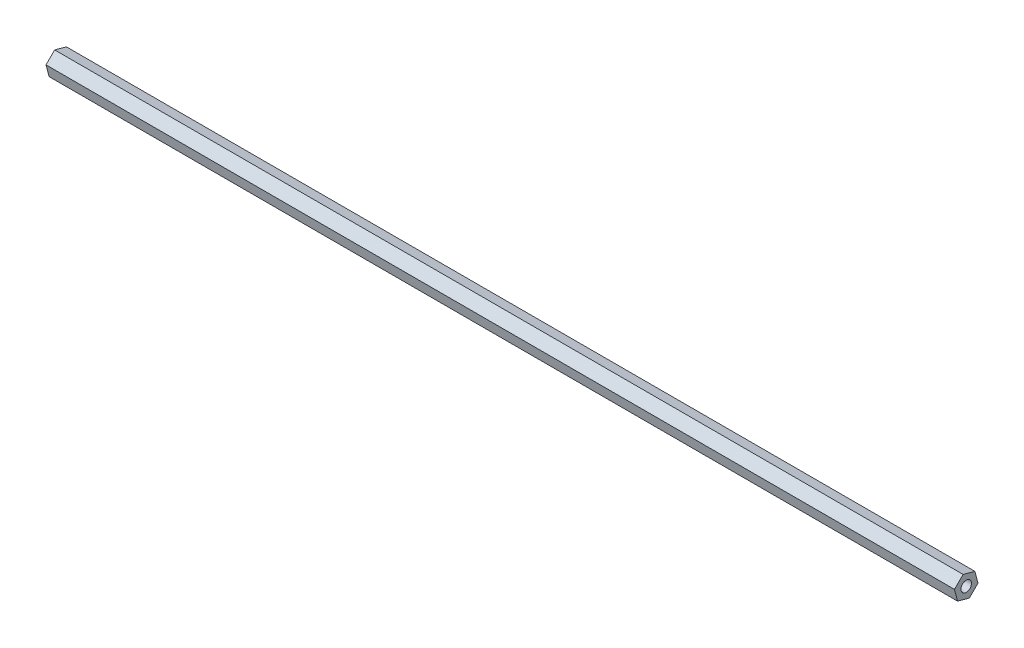
ISO-10303-21;
HEADER;
FILE_DESCRIPTION(('STEP AP214'),'2;1');
FILE_NAME('part.step','',(''),(''),'','','');
FILE_SCHEMA(('AUTOMOTIVE_DESIGN { 1 0 10303 214 1 1 1 1 }'));
ENDSEC;
DATA;
#1=APPLICATION_CONTEXT('core data for automotive mechanical design processes');
#2=APPLICATION_PROTOCOL_DEFINITION('international standard','automotive_design',2000,#1);
#3=PRODUCT_CONTEXT('',#1,'mechanical');
#4=PRODUCT('Part','Part','',(#3));
#5=PRODUCT_RELATED_PRODUCT_CATEGORY('part','',(#4));
#6=PRODUCT_DEFINITION_FORMATION('','',#4);
#7=PRODUCT_DEFINITION_CONTEXT('part definition',#1,'design');
#8=PRODUCT_DEFINITION('design','',#6,#7);
#9=PRODUCT_DEFINITION_SHAPE('','',#8);
#10=(LENGTH_UNIT() NAMED_UNIT(*) SI_UNIT(.MILLI.,.METRE.));
#11=(NAMED_UNIT(*) PLANE_ANGLE_UNIT() SI_UNIT($,.RADIAN.));
#12=(NAMED_UNIT(*) SI_UNIT($,.STERADIAN.) SOLID_ANGLE_UNIT());
#13=UNCERTAINTY_MEASURE_WITH_UNIT(LENGTH_MEASURE(1.E-05),#10,'distance_accuracy_value','');
#14=(GEOMETRIC_REPRESENTATION_CONTEXT(3) GLOBAL_UNCERTAINTY_ASSIGNED_CONTEXT((#13)) GLOBAL_UNIT_ASSIGNED_CONTEXT((#10,
#11,#12)) REPRESENTATION_CONTEXT('',''));
#15=CARTESIAN_POINT('',(0.,0.,0.));
#16=DIRECTION('',(0.,0.,1.));
#17=DIRECTION('',(1.,0.,0.));
#18=AXIS2_PLACEMENT_3D('',#15,#16,#17);
#19=CARTESIAN_POINT('',(546.1,-1.92681784977775,-7.07465238065527));
#20=DIRECTION('',(0.,-0.254850544088576,0.9669804549099));
#21=DIRECTION('',(0.,-0.9669804549099,-0.254850544088576));
#22=AXIS2_PLACEMENT_3D('',#19,#20,#21);
#23=PLANE('',#22);
#24=DIRECTION('',(0.,0.9669804549099,0.254850544088576));
#25=VECTOR('',#24,1.);
#26=CARTESIAN_POINT('',(0.,-1.92681784977775,-7.07465238065527));
#27=LINE('',#26,#25);
#28=CARTESIAN_POINT('',(0.,-1.92681784977775,-7.07465238065527));
#29=VERTEX_POINT('',#28);
#30=CARTESIAN_POINT('',(0.,5.16341975970264,-5.20599939670046));
#31=VERTEX_POINT('',#30);
#32=EDGE_CURVE('E120',#29,#31,#27,.T.);
#33=ORIENTED_EDGE('',*,*,#32,.T.);
#34=DIRECTION('',(-1.,0.,0.));
#35=VECTOR('',#34,1.);
#36=CARTESIAN_POINT('',(546.1,5.16341975970264,-5.20599939670046));
#37=LINE('',#36,#35);
#38=CARTESIAN_POINT('',(546.1,5.16341975970264,-5.20599939670046));
#39=VERTEX_POINT('',#38);
#40=EDGE_CURVE('E11',#39,#31,#37,.T.);
#41=ORIENTED_EDGE('',*,*,#40,.F.);
#42=DIRECTION('',(0.,0.9669804549099,0.254850544088576));
#43=VECTOR('',#42,1.);
#44=CARTESIAN_POINT('',(546.1,-1.92681784977775,-7.07465238065527));
#45=LINE('',#44,#43);
#46=CARTESIAN_POINT('',(546.1,-1.92681784977775,-7.07465238065527));
#47=VERTEX_POINT('',#46);
#48=EDGE_CURVE('E131',#47,#39,#45,.T.);
#49=ORIENTED_EDGE('',*,*,#48,.F.);
#50=DIRECTION('',(-1.,0.,0.));
#51=VECTOR('',#50,1.);
#52=CARTESIAN_POINT('',(546.1,-1.92681784977775,-7.07465238065527));
#53=LINE('',#52,#51);
#54=EDGE_CURVE('E116',#47,#29,#53,.T.);
#55=ORIENTED_EDGE('',*,*,#54,.T.);
#56=EDGE_LOOP('',(#33,#41,#49,#55));
#57=FACE_BOUND('',#56,.T.);
#58=ADVANCED_FACE('F36',(#57),#23,.F.);
#59=CARTESIAN_POINT('',(546.1,5.16341975970264,-5.20599939670046));
#60=DIRECTION('',(0.,-0.964854910959294,0.262783182105958));
#61=DIRECTION('',(0.,-0.262783182105958,-0.964854910959294));
#62=AXIS2_PLACEMENT_3D('',#59,#60,#61);
#63=PLANE('',#62);
#64=DIRECTION('',(0.,0.262783182105958,0.964854910959294));
#65=VECTOR('',#64,1.);
#66=CARTESIAN_POINT('',(0.,5.16341975970264,-5.20599939670046));
#67=LINE('',#66,#65);
#68=CARTESIAN_POINT('',(0.,7.09023760948039,1.8686529839548));
#69=VERTEX_POINT('',#68);
#70=EDGE_CURVE('E123',#31,#69,#67,.T.);
#71=ORIENTED_EDGE('',*,*,#70,.T.);
#72=DIRECTION('',(-1.,0.,0.));
#73=VECTOR('',#72,1.);
#74=CARTESIAN_POINT('',(546.1,7.09023760948039,1.8686529839548));
#75=LINE('',#74,#73);
#76=CARTESIAN_POINT('',(546.1,7.09023760948039,1.8686529839548));
#77=VERTEX_POINT('',#76);
#78=EDGE_CURVE('E44',#77,#69,#75,.T.);
#79=ORIENTED_EDGE('',*,*,#78,.F.);
#80=DIRECTION('',(0.,0.262783182105958,0.964854910959294));
#81=VECTOR('',#80,1.);
#82=CARTESIAN_POINT('',(546.1,5.16341975970264,-5.20599939670046));
#83=LINE('',#82,#81);
#84=EDGE_CURVE('E89',#39,#77,#83,.T.);
#85=ORIENTED_EDGE('',*,*,#84,.F.);
#86=ORIENTED_EDGE('',*,*,#40,.T.);
#87=EDGE_LOOP('',(#71,#79,#85,#86));
#88=FACE_BOUND('',#87,.T.);
#89=ADVANCED_FACE('F156',(#88),#63,.F.);
#90=CARTESIAN_POINT('',(546.1,7.09023760948039,1.8686529839548));
#91=DIRECTION('',(0.,-0.710004366870719,-0.704197272803942));
#92=DIRECTION('',(0.,0.704197272803942,-0.710004366870719));
#93=AXIS2_PLACEMENT_3D('',#90,#91,#92);
#94=PLANE('',#93);
#95=DIRECTION('',(0.,-0.704197272803942,0.710004366870719));
#96=VECTOR('',#95,1.);
#97=CARTESIAN_POINT('',(0.,7.09023760948039,1.8686529839548));
#98=LINE('',#97,#96);
#99=CARTESIAN_POINT('',(0.,1.92681784977774,7.07465238065526));
#100=VERTEX_POINT('',#99);
#101=EDGE_CURVE('E126',#69,#100,#98,.T.);
#102=ORIENTED_EDGE('',*,*,#101,.T.);
#103=DIRECTION('',(-1.,0.,0.));
#104=VECTOR('',#103,1.);
#105=CARTESIAN_POINT('',(546.1,1.92681784977774,7.07465238065526));
#106=LINE('',#105,#104);
#107=CARTESIAN_POINT('',(546.1,1.92681784977774,7.07465238065526));
#108=VERTEX_POINT('',#107);
#109=EDGE_CURVE('E111',#108,#100,#106,.T.);
#110=ORIENTED_EDGE('',*,*,#109,.F.);
#111=DIRECTION('',(0.,-0.704197272803942,0.710004366870719));
#112=VECTOR('',#111,1.);
#113=CARTESIAN_POINT('',(546.1,7.09023760948039,1.8686529839548));
#114=LINE('',#113,#112);
#115=EDGE_CURVE('E102',#77,#108,#114,.T.);
#116=ORIENTED_EDGE('',*,*,#115,.F.);
#117=ORIENTED_EDGE('',*,*,#78,.T.);
#118=EDGE_LOOP('',(#102,#110,#116,#117));
#119=FACE_BOUND('',#118,.T.);
#120=ADVANCED_FACE('F137',(#119),#94,.F.);
#121=CARTESIAN_POINT('',(546.1,1.92681784977774,7.07465238065526));
#122=DIRECTION('',(0.,0.254850544088575,-0.9669804549099));
#123=DIRECTION('',(0.,0.9669804549099,0.254850544088575));
#124=AXIS2_PLACEMENT_3D('',#121,#122,#123);
#125=PLANE('',#124);
#126=DIRECTION('',(0.,-0.9669804549099,-0.254850544088575));
#127=VECTOR('',#126,1.);
#128=CARTESIAN_POINT('',(0.,1.92681784977774,7.07465238065526));
#129=LINE('',#128,#127);
#130=CARTESIAN_POINT('',(0.,-5.16341975970264,5.20599939670046));
#131=VERTEX_POINT('',#130);
#132=EDGE_CURVE('E110',#100,#131,#129,.T.);
#133=ORIENTED_EDGE('',*,*,#132,.T.);
#134=DIRECTION('',(-1.,0.,0.));
#135=VECTOR('',#134,1.);
#136=CARTESIAN_POINT('',(546.1,-5.16341975970264,5.20599939670046));
#137=LINE('',#136,#135);
#138=CARTESIAN_POINT('',(546.1,-5.16341975970264,5.20599939670046));
#139=VERTEX_POINT('',#138);
#140=EDGE_CURVE('E107',#139,#131,#137,.T.);
#141=ORIENTED_EDGE('',*,*,#140,.F.);
#142=DIRECTION('',(0.,-0.9669804549099,-0.254850544088575));
#143=VECTOR('',#142,1.);
#144=CARTESIAN_POINT('',(546.1,1.92681784977774,7.07465238065526));
#145=LINE('',#144,#143);
#146=EDGE_CURVE('E96',#108,#139,#145,.T.);
#147=ORIENTED_EDGE('',*,*,#146,.F.);
#148=ORIENTED_EDGE('',*,*,#109,.T.);
#149=EDGE_LOOP('',(#133,#141,#147,#148));
#150=FACE_BOUND('',#149,.T.);
#151=ADVANCED_FACE('F108',(#150),#125,.F.);
#152=CARTESIAN_POINT('',(546.1,-5.16341975970264,5.20599939670046));
#153=DIRECTION('',(0.,0.964854910959294,-0.262783182105958));
#154=DIRECTION('',(0.,0.262783182105958,0.964854910959294));
#155=AXIS2_PLACEMENT_3D('',#152,#153,#154);
#156=PLANE('',#155);
#157=DIRECTION('',(0.,-0.262783182105958,-0.964854910959294));
#158=VECTOR('',#157,1.);
#159=CARTESIAN_POINT('',(0.,-5.16341975970264,5.20599939670046));
#160=LINE('',#159,#158);
#161=CARTESIAN_POINT('',(0.,-7.09023760948039,-1.86865298395481));
#162=VERTEX_POINT('',#161);
#163=EDGE_CURVE('E75',#131,#162,#160,.T.);
#164=ORIENTED_EDGE('',*,*,#163,.T.);
#165=DIRECTION('',(-1.,0.,0.));
#166=VECTOR('',#165,1.);
#167=CARTESIAN_POINT('',(546.1,-7.09023760948039,-1.86865298395481));
#168=LINE('',#167,#166);
#169=CARTESIAN_POINT('',(546.1,-7.09023760948039,-1.86865298395481));
#170=VERTEX_POINT('',#169);
#171=EDGE_CURVE('E112',#170,#162,#168,.T.);
#172=ORIENTED_EDGE('',*,*,#171,.F.);
#173=DIRECTION('',(0.,-0.262783182105958,-0.964854910959294));
#174=VECTOR('',#173,1.);
#175=CARTESIAN_POINT('',(546.1,-5.16341975970264,5.20599939670046));
#176=LINE('',#175,#174);
#177=EDGE_CURVE('E100',#139,#170,#176,.T.);
#178=ORIENTED_EDGE('',*,*,#177,.F.);
#179=ORIENTED_EDGE('',*,*,#140,.T.);
#180=EDGE_LOOP('',(#164,#172,#178,#179));
#181=FACE_BOUND('',#180,.T.);
#182=ADVANCED_FACE('F114',(#181),#156,.F.);
#183=CARTESIAN_POINT('',(546.1,-7.09023760948039,-1.86865298395481));
#184=DIRECTION('',(0.,0.710004366870719,0.704197272803942));
#185=DIRECTION('',(0.,-0.704197272803942,0.710004366870719));
#186=AXIS2_PLACEMENT_3D('',#183,#184,#185);
#187=PLANE('',#186);
#188=DIRECTION('',(0.,0.704197272803942,-0.710004366870719));
#189=VECTOR('',#188,1.);
#190=CARTESIAN_POINT('',(0.,-7.09023760948039,-1.86865298395481));
#191=LINE('',#190,#189);
#192=EDGE_CURVE('E81',#162,#29,#191,.T.);
#193=ORIENTED_EDGE('',*,*,#192,.T.);
#194=ORIENTED_EDGE('',*,*,#54,.F.);
#195=DIRECTION('',(0.,0.704197272803942,-0.710004366870719));
#196=VECTOR('',#195,1.);
#197=CARTESIAN_POINT('',(546.1,-7.09023760948039,-1.86865298395481));
#198=LINE('',#197,#196);
#199=EDGE_CURVE('E52',#170,#47,#198,.T.);
#200=ORIENTED_EDGE('',*,*,#199,.F.);
#201=ORIENTED_EDGE('',*,*,#171,.T.);
#202=EDGE_LOOP('',(#193,#194,#200,#201));
#203=FACE_BOUND('',#202,.T.);
#204=ADVANCED_FACE('F144',(#203),#187,.F.);
#205=CARTESIAN_POINT('',(546.1,0.,0.));
#206=DIRECTION('',(1.,0.,0.));
#207=DIRECTION('',(0.,0.,-1.));
#208=AXIS2_PLACEMENT_3D('',#205,#206,#207);
#209=PLANE('',#208);
#210=CARTESIAN_POINT('',(546.1,0.,0.));
#211=DIRECTION('',(1.,0.,0.));
#212=DIRECTION('',(0.,0.,-1.));
#213=AXIS2_PLACEMENT_3D('',#210,#211,#212);
#214=CIRCLE('',#213,3.175);
#215=CARTESIAN_POINT('',(546.1,0.,-3.175));
#216=VERTEX_POINT('',#215);
#217=EDGE_CURVE('E211',#216,#216,#214,.T.);
#218=ORIENTED_EDGE('',*,*,#217,.F.);
#219=EDGE_LOOP('',(#218));
#220=FACE_BOUND('',#219,.T.);
#221=ORIENTED_EDGE('',*,*,#48,.T.);
#222=ORIENTED_EDGE('',*,*,#84,.T.);
#223=ORIENTED_EDGE('',*,*,#115,.T.);
#224=ORIENTED_EDGE('',*,*,#146,.T.);
#225=ORIENTED_EDGE('',*,*,#177,.T.);
#226=ORIENTED_EDGE('',*,*,#199,.T.);
#227=EDGE_LOOP('',(#221,#222,#223,#224,#225,#226));
#228=FACE_BOUND('',#227,.T.);
#229=ADVANCED_FACE('F98',(#220,#228),#209,.T.);
#230=CARTESIAN_POINT('',(0.,0.,0.));
#231=DIRECTION('',(1.,0.,0.));
#232=DIRECTION('',(0.,0.,-1.));
#233=AXIS2_PLACEMENT_3D('',#230,#231,#232);
#234=PLANE('',#233);
#235=CARTESIAN_POINT('',(0.,0.,0.));
#236=DIRECTION('',(1.,0.,0.));
#237=DIRECTION('',(0.,0.,-1.));
#238=AXIS2_PLACEMENT_3D('',#235,#236,#237);
#239=CIRCLE('',#238,3.175);
#240=CARTESIAN_POINT('',(0.,0.,-3.175));
#241=VERTEX_POINT('',#240);
#242=EDGE_CURVE('E124',#241,#241,#239,.T.);
#243=ORIENTED_EDGE('',*,*,#242,.T.);
#244=EDGE_LOOP('',(#243));
#245=FACE_BOUND('',#244,.T.);
#246=ORIENTED_EDGE('',*,*,#32,.F.);
#247=ORIENTED_EDGE('',*,*,#192,.F.);
#248=ORIENTED_EDGE('',*,*,#163,.F.);
#249=ORIENTED_EDGE('',*,*,#132,.F.);
#250=ORIENTED_EDGE('',*,*,#101,.F.);
#251=ORIENTED_EDGE('',*,*,#70,.F.);
#252=EDGE_LOOP('',(#246,#247,#248,#249,#250,#251));
#253=FACE_BOUND('',#252,.T.);
#254=ADVANCED_FACE('F140',(#245,#253),#234,.F.);
#255=CARTESIAN_POINT('',(0.,0.,0.));
#256=DIRECTION('',(1.,0.,0.));
#257=DIRECTION('',(0.,0.,-1.));
#258=AXIS2_PLACEMENT_3D('',#255,#256,#257);
#259=CYLINDRICAL_SURFACE('',#258,3.175);
#260=ORIENTED_EDGE('',*,*,#242,.F.);
#261=EDGE_LOOP('',(#260));
#262=FACE_BOUND('',#261,.T.);
#263=ORIENTED_EDGE('',*,*,#217,.T.);
#264=EDGE_LOOP('',(#263));
#265=FACE_BOUND('',#264,.T.);
#266=ADVANCED_FACE('F193',(#262,#265),#259,.F.);
#267=CLOSED_SHELL('',(#58,#89,#120,#151,#182,#204,#229,#254,#266));
#268=MANIFOLD_SOLID_BREP('B2',#267);
#269=ADVANCED_BREP_SHAPE_REPRESENTATION('',(#18,#268),#14);
#270=SHAPE_DEFINITION_REPRESENTATION(#9,#269);
ENDSEC;
END-ISO-10303-21;
